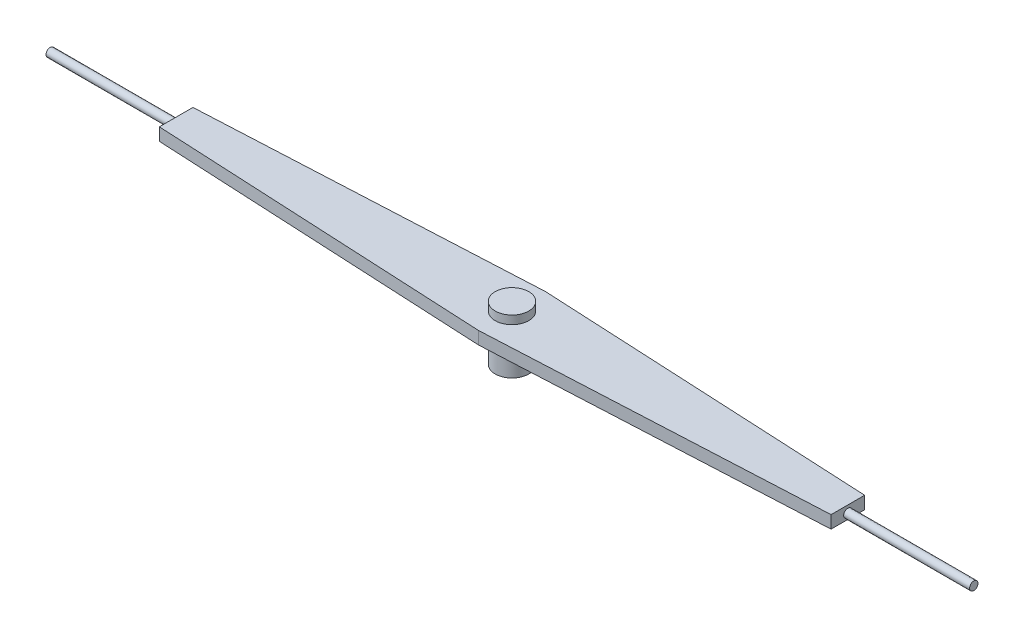
ISO-10303-21;
HEADER;
FILE_DESCRIPTION(('STEP AP214'),'2;1');
FILE_NAME('part.step','',(''),(''),'','','');
FILE_SCHEMA(('AUTOMOTIVE_DESIGN { 1 0 10303 214 1 1 1 1 }'));
ENDSEC;
DATA;
#1=APPLICATION_CONTEXT('core data for automotive mechanical design processes');
#2=APPLICATION_PROTOCOL_DEFINITION('international standard','automotive_design',2000,#1);
#3=PRODUCT_CONTEXT('',#1,'mechanical');
#4=PRODUCT('Part','Part','',(#3));
#5=PRODUCT_RELATED_PRODUCT_CATEGORY('part','',(#4));
#6=PRODUCT_DEFINITION_FORMATION('','',#4);
#7=PRODUCT_DEFINITION_CONTEXT('part definition',#1,'design');
#8=PRODUCT_DEFINITION('design','',#6,#7);
#9=PRODUCT_DEFINITION_SHAPE('','',#8);
#10=(LENGTH_UNIT() NAMED_UNIT(*) SI_UNIT(.MILLI.,.METRE.));
#11=(NAMED_UNIT(*) PLANE_ANGLE_UNIT() SI_UNIT($,.RADIAN.));
#12=(NAMED_UNIT(*) SI_UNIT($,.STERADIAN.) SOLID_ANGLE_UNIT());
#13=UNCERTAINTY_MEASURE_WITH_UNIT(LENGTH_MEASURE(1.E-05),#10,'distance_accuracy_value','');
#14=(GEOMETRIC_REPRESENTATION_CONTEXT(3) GLOBAL_UNCERTAINTY_ASSIGNED_CONTEXT((#13)) GLOBAL_UNIT_ASSIGNED_CONTEXT((#10,
#11,#12)) REPRESENTATION_CONTEXT('',''));
#15=CARTESIAN_POINT('',(0.,0.,0.));
#16=DIRECTION('',(0.,0.,1.));
#17=DIRECTION('',(1.,0.,0.));
#18=AXIS2_PLACEMENT_3D('',#15,#16,#17);
#19=CARTESIAN_POINT('',(-200.,7.5,0.));
#20=DIRECTION('',(-1.,0.,0.));
#21=DIRECTION('',(0.,0.,1.));
#22=AXIS2_PLACEMENT_3D('',#19,#20,#21);
#23=PLANE('',#22);
#24=CARTESIAN_POINT('',(-200.,3.46911629665806,0.));
#25=DIRECTION('',(-1.,0.,0.));
#26=DIRECTION('',(0.,0.,1.));
#27=AXIS2_PLACEMENT_3D('',#24,#25,#26);
#28=CIRCLE('',#27,2.5);
#29=CARTESIAN_POINT('',(-200.,3.46911629665806,2.5));
#30=VERTEX_POINT('',#29);
#31=EDGE_CURVE('E44',#30,#30,#28,.T.);
#32=ORIENTED_EDGE('',*,*,#31,.F.);
#33=EDGE_LOOP('',(#32));
#34=FACE_BOUND('',#33,.T.);
#35=DIRECTION('',(0.,0.,-1.));
#36=VECTOR('',#35,1.);
#37=CARTESIAN_POINT('',(-200.,0.,0.));
#38=LINE('',#37,#36);
#39=CARTESIAN_POINT('',(-200.,0.,10.));
#40=VERTEX_POINT('',#39);
#41=CARTESIAN_POINT('',(-200.,0.,-10.));
#42=VERTEX_POINT('',#41);
#43=EDGE_CURVE('E118',#40,#42,#38,.T.);
#44=ORIENTED_EDGE('',*,*,#43,.F.);
#45=DIRECTION('',(0.,-1.,0.));
#46=VECTOR('',#45,1.);
#47=CARTESIAN_POINT('',(-200.,7.5,10.));
#48=LINE('',#47,#46);
#49=CARTESIAN_POINT('',(-200.,7.5,10.));
#50=VERTEX_POINT('',#49);
#51=EDGE_CURVE('E87',#50,#40,#48,.T.);
#52=ORIENTED_EDGE('',*,*,#51,.F.);
#53=DIRECTION('',(0.,0.,-1.));
#54=VECTOR('',#53,1.);
#55=CARTESIAN_POINT('',(-200.,7.5,0.));
#56=LINE('',#55,#54);
#57=CARTESIAN_POINT('',(-200.,7.5,-10.));
#58=VERTEX_POINT('',#57);
#59=EDGE_CURVE('E132',#50,#58,#56,.T.);
#60=ORIENTED_EDGE('',*,*,#59,.T.);
#61=DIRECTION('',(0.,-1.,0.));
#62=VECTOR('',#61,1.);
#63=CARTESIAN_POINT('',(-200.,7.5,-10.));
#64=LINE('',#63,#62);
#65=EDGE_CURVE('E82',#58,#42,#64,.T.);
#66=ORIENTED_EDGE('',*,*,#65,.T.);
#67=EDGE_LOOP('',(#44,#52,#60,#66));
#68=FACE_BOUND('',#67,.T.);
#69=ADVANCED_FACE('F36',(#34,#68),#23,.T.);
#70=CARTESIAN_POINT('',(-0.997506234413966,7.5,19.9501246882793));
#71=DIRECTION('',(-0.0499376169438923,0.,0.998752338877845));
#72=DIRECTION('',(0.998752338877845,0.,0.0499376169438923));
#73=AXIS2_PLACEMENT_3D('',#70,#71,#72);
#74=PLANE('',#73);
#75=DIRECTION('',(-0.998752338877845,0.,-0.0499376169438923));
#76=VECTOR('',#75,1.);
#77=CARTESIAN_POINT('',(-0.997506234413966,0.,19.9501246882793));
#78=LINE('',#77,#76);
#79=CARTESIAN_POINT('',(0.,0.,20.));
#80=VERTEX_POINT('',#79);
#81=EDGE_CURVE('E121',#80,#40,#78,.T.);
#82=ORIENTED_EDGE('',*,*,#81,.F.);
#83=DIRECTION('',(0.,-1.,0.));
#84=VECTOR('',#83,1.);
#85=CARTESIAN_POINT('',(0.,7.5,20.));
#86=LINE('',#85,#84);
#87=CARTESIAN_POINT('',(0.,7.5,20.));
#88=VERTEX_POINT('',#87);
#89=EDGE_CURVE('E136',#88,#80,#86,.T.);
#90=ORIENTED_EDGE('',*,*,#89,.F.);
#91=DIRECTION('',(-0.998752338877845,0.,-0.0499376169438923));
#92=VECTOR('',#91,1.);
#93=CARTESIAN_POINT('',(-0.997506234413966,7.5,19.9501246882793));
#94=LINE('',#93,#92);
#95=EDGE_CURVE('E150',#88,#50,#94,.T.);
#96=ORIENTED_EDGE('',*,*,#95,.T.);
#97=ORIENTED_EDGE('',*,*,#51,.T.);
#98=EDGE_LOOP('',(#82,#90,#96,#97));
#99=FACE_BOUND('',#98,.T.);
#100=ADVANCED_FACE('F159',(#99),#74,.T.);
#101=CARTESIAN_POINT('',(0.997506234413966,7.5,19.9501246882793));
#102=DIRECTION('',(0.0499376169438923,0.,0.998752338877845));
#103=DIRECTION('',(0.998752338877845,0.,-0.0499376169438923));
#104=AXIS2_PLACEMENT_3D('',#101,#102,#103);
#105=PLANE('',#104);
#106=DIRECTION('',(-0.998752338877845,0.,0.0499376169438923));
#107=VECTOR('',#106,1.);
#108=CARTESIAN_POINT('',(0.997506234413966,0.,19.9501246882793));
#109=LINE('',#108,#107);
#110=CARTESIAN_POINT('',(200.,0.,10.));
#111=VERTEX_POINT('',#110);
#112=EDGE_CURVE('E125',#111,#80,#109,.T.);
#113=ORIENTED_EDGE('',*,*,#112,.F.);
#114=DIRECTION('',(0.,-1.,0.));
#115=VECTOR('',#114,1.);
#116=CARTESIAN_POINT('',(200.,7.5,10.));
#117=LINE('',#116,#115);
#118=CARTESIAN_POINT('',(200.,7.5,10.));
#119=VERTEX_POINT('',#118);
#120=EDGE_CURVE('E110',#119,#111,#117,.T.);
#121=ORIENTED_EDGE('',*,*,#120,.F.);
#122=DIRECTION('',(-0.998752338877845,0.,0.0499376169438923));
#123=VECTOR('',#122,1.);
#124=CARTESIAN_POINT('',(0.997506234413966,7.5,19.9501246882793));
#125=LINE('',#124,#123);
#126=EDGE_CURVE('E103',#119,#88,#125,.T.);
#127=ORIENTED_EDGE('',*,*,#126,.T.);
#128=ORIENTED_EDGE('',*,*,#89,.T.);
#129=EDGE_LOOP('',(#113,#121,#127,#128));
#130=FACE_BOUND('',#129,.T.);
#131=ADVANCED_FACE('F153',(#130),#105,.T.);
#132=CARTESIAN_POINT('',(200.,7.5,0.));
#133=DIRECTION('',(-1.,0.,0.));
#134=DIRECTION('',(0.,0.,1.));
#135=AXIS2_PLACEMENT_3D('',#132,#133,#134);
#136=PLANE('',#135);
#137=CARTESIAN_POINT('',(200.,3.29626478690789,0.));
#138=DIRECTION('',(1.,0.,0.));
#139=DIRECTION('',(0.,0.,-1.));
#140=AXIS2_PLACEMENT_3D('',#137,#138,#139);
#141=CIRCLE('',#140,2.5);
#142=CARTESIAN_POINT('',(200.,3.29626478690789,-2.5));
#143=VERTEX_POINT('',#142);
#144=EDGE_CURVE('E137',#143,#143,#141,.T.);
#145=ORIENTED_EDGE('',*,*,#144,.F.);
#146=EDGE_LOOP('',(#145));
#147=FACE_BOUND('',#146,.T.);
#148=DIRECTION('',(0.,0.,-1.));
#149=VECTOR('',#148,1.);
#150=CARTESIAN_POINT('',(200.,0.,0.));
#151=LINE('',#150,#149);
#152=CARTESIAN_POINT('',(200.,0.,-10.));
#153=VERTEX_POINT('',#152);
#154=EDGE_CURVE('E109',#111,#153,#151,.T.);
#155=ORIENTED_EDGE('',*,*,#154,.T.);
#156=DIRECTION('',(0.,-1.,0.));
#157=VECTOR('',#156,1.);
#158=CARTESIAN_POINT('',(200.,7.5,-10.));
#159=LINE('',#158,#157);
#160=CARTESIAN_POINT('',(200.,7.5,-10.));
#161=VERTEX_POINT('',#160);
#162=EDGE_CURVE('E106',#161,#153,#159,.T.);
#163=ORIENTED_EDGE('',*,*,#162,.F.);
#164=DIRECTION('',(0.,0.,-1.));
#165=VECTOR('',#164,1.);
#166=CARTESIAN_POINT('',(200.,7.5,0.));
#167=LINE('',#166,#165);
#168=EDGE_CURVE('E96',#119,#161,#167,.T.);
#169=ORIENTED_EDGE('',*,*,#168,.F.);
#170=ORIENTED_EDGE('',*,*,#120,.T.);
#171=EDGE_LOOP('',(#155,#163,#169,#170));
#172=FACE_BOUND('',#171,.T.);
#173=ADVANCED_FACE('F107',(#147,#172),#136,.F.);
#174=CARTESIAN_POINT('',(0.997506234413965,7.5,-19.9501246882793));
#175=DIRECTION('',(-0.0499376169438922,0.,0.998752338877845));
#176=DIRECTION('',(0.998752338877845,0.,0.0499376169438922));
#177=AXIS2_PLACEMENT_3D('',#174,#175,#176);
#178=PLANE('',#177);
#179=DIRECTION('',(-0.998752338877845,0.,-0.0499376169438922));
#180=VECTOR('',#179,1.);
#181=CARTESIAN_POINT('',(0.997506234413965,0.,-19.9501246882793));
#182=LINE('',#181,#180);
#183=CARTESIAN_POINT('',(0.,0.,-20.));
#184=VERTEX_POINT('',#183);
#185=EDGE_CURVE('E75',#153,#184,#182,.T.);
#186=ORIENTED_EDGE('',*,*,#185,.T.);
#187=DIRECTION('',(0.,-1.,0.));
#188=VECTOR('',#187,1.);
#189=CARTESIAN_POINT('',(0.,7.5,-20.));
#190=LINE('',#189,#188);
#191=CARTESIAN_POINT('',(0.,7.5,-20.));
#192=VERTEX_POINT('',#191);
#193=EDGE_CURVE('E111',#192,#184,#190,.T.);
#194=ORIENTED_EDGE('',*,*,#193,.F.);
#195=DIRECTION('',(-0.998752338877845,0.,-0.0499376169438922));
#196=VECTOR('',#195,1.);
#197=CARTESIAN_POINT('',(0.997506234413965,7.5,-19.9501246882793));
#198=LINE('',#197,#196);
#199=EDGE_CURVE('E100',#161,#192,#198,.T.);
#200=ORIENTED_EDGE('',*,*,#199,.F.);
#201=ORIENTED_EDGE('',*,*,#162,.T.);
#202=EDGE_LOOP('',(#186,#194,#200,#201));
#203=FACE_BOUND('',#202,.T.);
#204=ADVANCED_FACE('F113',(#203),#178,.F.);
#205=CARTESIAN_POINT('',(-0.997506234413965,7.5,-19.9501246882793));
#206=DIRECTION('',(0.0499376169438922,0.,0.998752338877845));
#207=DIRECTION('',(0.998752338877845,0.,-0.0499376169438922));
#208=AXIS2_PLACEMENT_3D('',#205,#206,#207);
#209=PLANE('',#208);
#210=DIRECTION('',(-0.998752338877845,0.,0.0499376169438922));
#211=VECTOR('',#210,1.);
#212=CARTESIAN_POINT('',(-0.997506234413965,0.,-19.9501246882793));
#213=LINE('',#212,#211);
#214=EDGE_CURVE('E130',#184,#42,#213,.T.);
#215=ORIENTED_EDGE('',*,*,#214,.T.);
#216=ORIENTED_EDGE('',*,*,#65,.F.);
#217=DIRECTION('',(-0.998752338877845,0.,0.0499376169438922));
#218=VECTOR('',#217,1.);
#219=CARTESIAN_POINT('',(-0.997506234413965,7.5,-19.9501246882793));
#220=LINE('',#219,#218);
#221=EDGE_CURVE('E52',#192,#58,#220,.T.);
#222=ORIENTED_EDGE('',*,*,#221,.F.);
#223=ORIENTED_EDGE('',*,*,#193,.T.);
#224=EDGE_LOOP('',(#215,#216,#222,#223));
#225=FACE_BOUND('',#224,.T.);
#226=ADVANCED_FACE('F158',(#225),#209,.F.);
#227=CARTESIAN_POINT('',(0.,7.5,0.));
#228=DIRECTION('',(0.,1.,0.));
#229=DIRECTION('',(0.,0.,1.));
#230=AXIS2_PLACEMENT_3D('',#227,#228,#229);
#231=PLANE('',#230);
#232=CARTESIAN_POINT('',(0.,7.5,0.));
#233=DIRECTION('',(0.,1.,0.));
#234=DIRECTION('',(0.,0.,1.));
#235=AXIS2_PLACEMENT_3D('',#232,#233,#234);
#236=CIRCLE('',#235,10.);
#237=CARTESIAN_POINT('',(0.,7.5,10.));
#238=VERTEX_POINT('',#237);
#239=EDGE_CURVE('E229',#238,#238,#236,.T.);
#240=ORIENTED_EDGE('',*,*,#239,.F.);
#241=EDGE_LOOP('',(#240));
#242=FACE_BOUND('',#241,.T.);
#243=ORIENTED_EDGE('',*,*,#59,.F.);
#244=ORIENTED_EDGE('',*,*,#95,.F.);
#245=ORIENTED_EDGE('',*,*,#126,.F.);
#246=ORIENTED_EDGE('',*,*,#168,.T.);
#247=ORIENTED_EDGE('',*,*,#199,.T.);
#248=ORIENTED_EDGE('',*,*,#221,.T.);
#249=EDGE_LOOP('',(#243,#244,#245,#246,#247,#248));
#250=FACE_BOUND('',#249,.T.);
#251=ADVANCED_FACE('F98',(#242,#250),#231,.T.);
#252=CARTESIAN_POINT('',(0.,0.,0.));
#253=DIRECTION('',(0.,1.,0.));
#254=DIRECTION('',(0.,0.,1.));
#255=AXIS2_PLACEMENT_3D('',#252,#253,#254);
#256=PLANE('',#255);
#257=CARTESIAN_POINT('',(0.,0.,0.));
#258=DIRECTION('',(0.,1.,0.));
#259=DIRECTION('',(0.,0.,1.));
#260=AXIS2_PLACEMENT_3D('',#257,#258,#259);
#261=CIRCLE('',#260,10.);
#262=CARTESIAN_POINT('',(0.,0.,10.));
#263=VERTEX_POINT('',#262);
#264=EDGE_CURVE('E11',#263,#263,#261,.F.);
#265=ORIENTED_EDGE('',*,*,#264,.F.);
#266=EDGE_LOOP('',(#265));
#267=FACE_BOUND('',#266,.T.);
#268=ORIENTED_EDGE('',*,*,#43,.T.);
#269=ORIENTED_EDGE('',*,*,#214,.F.);
#270=ORIENTED_EDGE('',*,*,#185,.F.);
#271=ORIENTED_EDGE('',*,*,#154,.F.);
#272=ORIENTED_EDGE('',*,*,#112,.T.);
#273=ORIENTED_EDGE('',*,*,#81,.T.);
#274=EDGE_LOOP('',(#268,#269,#270,#271,#272,#273));
#275=FACE_BOUND('',#274,.T.);
#276=ADVANCED_FACE('F155',(#267,#275),#256,.F.);
#277=CARTESIAN_POINT('',(275.,3.29626478690789,0.));
#278=DIRECTION('',(-1.,0.,0.));
#279=DIRECTION('',(0.,0.,1.));
#280=AXIS2_PLACEMENT_3D('',#277,#278,#279);
#281=CYLINDRICAL_SURFACE('',#280,2.5);
#282=CARTESIAN_POINT('',(275.,3.29626478690789,0.));
#283=DIRECTION('',(1.,0.,0.));
#284=DIRECTION('',(0.,0.,-1.));
#285=AXIS2_PLACEMENT_3D('',#282,#283,#284);
#286=CIRCLE('',#285,2.5);
#287=CARTESIAN_POINT('',(275.,3.29626478690789,-2.5));
#288=VERTEX_POINT('',#287);
#289=EDGE_CURVE('E122',#288,#288,#286,.T.);
#290=ORIENTED_EDGE('',*,*,#289,.F.);
#291=EDGE_LOOP('',(#290));
#292=FACE_BOUND('',#291,.T.);
#293=ORIENTED_EDGE('',*,*,#144,.T.);
#294=EDGE_LOOP('',(#293));
#295=FACE_BOUND('',#294,.T.);
#296=ADVANCED_FACE('F177',(#292,#295),#281,.T.);
#297=CARTESIAN_POINT('',(275.,3.29626478690789,0.));
#298=DIRECTION('',(1.,0.,0.));
#299=DIRECTION('',(0.,0.,-1.));
#300=AXIS2_PLACEMENT_3D('',#297,#298,#299);
#301=PLANE('',#300);
#302=ORIENTED_EDGE('',*,*,#289,.T.);
#303=EDGE_LOOP('',(#302));
#304=FACE_BOUND('',#303,.T.);
#305=ADVANCED_FACE('F184',(#304),#301,.T.);
#306=CARTESIAN_POINT('',(-275.,3.46911629665806,0.));
#307=DIRECTION('',(1.,0.,0.));
#308=DIRECTION('',(0.,0.,-1.));
#309=AXIS2_PLACEMENT_3D('',#306,#307,#308);
#310=CYLINDRICAL_SURFACE('',#309,2.5);
#311=CARTESIAN_POINT('',(-275.,3.46911629665806,0.));
#312=DIRECTION('',(-1.,0.,0.));
#313=DIRECTION('',(0.,0.,1.));
#314=AXIS2_PLACEMENT_3D('',#311,#312,#313);
#315=CIRCLE('',#314,2.5);
#316=CARTESIAN_POINT('',(-275.,3.46911629665806,2.5));
#317=VERTEX_POINT('',#316);
#318=EDGE_CURVE('E237',#317,#317,#315,.T.);
#319=ORIENTED_EDGE('',*,*,#318,.F.);
#320=EDGE_LOOP('',(#319));
#321=FACE_BOUND('',#320,.T.);
#322=ORIENTED_EDGE('',*,*,#31,.T.);
#323=EDGE_LOOP('',(#322));
#324=FACE_BOUND('',#323,.T.);
#325=ADVANCED_FACE('F188',(#321,#324),#310,.T.);
#326=CARTESIAN_POINT('',(-275.,3.46911629665806,0.));
#327=DIRECTION('',(-1.,0.,0.));
#328=DIRECTION('',(0.,0.,1.));
#329=AXIS2_PLACEMENT_3D('',#326,#327,#328);
#330=PLANE('',#329);
#331=ORIENTED_EDGE('',*,*,#318,.T.);
#332=EDGE_LOOP('',(#331));
#333=FACE_BOUND('',#332,.T.);
#334=ADVANCED_FACE('F192',(#333),#330,.T.);
#335=CARTESIAN_POINT('',(0.,12.5,0.));
#336=DIRECTION('',(0.,-1.,0.));
#337=DIRECTION('',(0.,0.,-1.));
#338=AXIS2_PLACEMENT_3D('',#335,#336,#337);
#339=CYLINDRICAL_SURFACE('',#338,10.);
#340=CARTESIAN_POINT('',(0.,12.5,0.));
#341=DIRECTION('',(0.,1.,0.));
#342=DIRECTION('',(0.,0.,1.));
#343=AXIS2_PLACEMENT_3D('',#340,#341,#342);
#344=CIRCLE('',#343,10.);
#345=CARTESIAN_POINT('',(0.,12.5,10.));
#346=VERTEX_POINT('',#345);
#347=EDGE_CURVE('E234',#346,#346,#344,.T.);
#348=ORIENTED_EDGE('',*,*,#347,.F.);
#349=EDGE_LOOP('',(#348));
#350=FACE_BOUND('',#349,.T.);
#351=ORIENTED_EDGE('',*,*,#239,.T.);
#352=EDGE_LOOP('',(#351));
#353=FACE_BOUND('',#352,.T.);
#354=ADVANCED_FACE('F196',(#350,#353),#339,.T.);
#355=CARTESIAN_POINT('',(0.,12.5,0.));
#356=DIRECTION('',(0.,1.,0.));
#357=DIRECTION('',(0.,0.,1.));
#358=AXIS2_PLACEMENT_3D('',#355,#356,#357);
#359=PLANE('',#358);
#360=ORIENTED_EDGE('',*,*,#347,.T.);
#361=EDGE_LOOP('',(#360));
#362=FACE_BOUND('',#361,.T.);
#363=ADVANCED_FACE('F200',(#362),#359,.T.);
#364=CARTESIAN_POINT('',(0.,-20.,0.));
#365=DIRECTION('',(0.,1.,0.));
#366=DIRECTION('',(0.,0.,1.));
#367=AXIS2_PLACEMENT_3D('',#364,#365,#366);
#368=CYLINDRICAL_SURFACE('',#367,10.);
#369=CARTESIAN_POINT('',(0.,-20.,0.));
#370=DIRECTION('',(0.,-1.,0.));
#371=DIRECTION('',(0.,0.,-1.));
#372=AXIS2_PLACEMENT_3D('',#369,#370,#371);
#373=CIRCLE('',#372,10.);
#374=CARTESIAN_POINT('',(0.,-20.,-10.));
#375=VERTEX_POINT('',#374);
#376=EDGE_CURVE('E225',#375,#375,#373,.T.);
#377=ORIENTED_EDGE('',*,*,#376,.F.);
#378=EDGE_LOOP('',(#377));
#379=FACE_BOUND('',#378,.T.);
#380=ORIENTED_EDGE('',*,*,#264,.T.);
#381=EDGE_LOOP('',(#380));
#382=FACE_BOUND('',#381,.T.);
#383=ADVANCED_FACE('F204',(#379,#382),#368,.T.);
#384=CARTESIAN_POINT('',(0.,-20.,0.));
#385=DIRECTION('',(0.,-1.,0.));
#386=DIRECTION('',(0.,0.,-1.));
#387=AXIS2_PLACEMENT_3D('',#384,#385,#386);
#388=PLANE('',#387);
#389=CARTESIAN_POINT('',(0.,-20.,0.));
#390=DIRECTION('',(0.,-1.,0.));
#391=DIRECTION('',(0.,0.,-1.));
#392=AXIS2_PLACEMENT_3D('',#389,#390,#391);
#393=CIRCLE('',#392,8.);
#394=CARTESIAN_POINT('',(0.,-20.,-8.));
#395=VERTEX_POINT('',#394);
#396=EDGE_CURVE('E226',#395,#395,#393,.T.);
#397=ORIENTED_EDGE('',*,*,#396,.F.);
#398=EDGE_LOOP('',(#397));
#399=FACE_BOUND('',#398,.T.);
#400=ORIENTED_EDGE('',*,*,#376,.T.);
#401=EDGE_LOOP('',(#400));
#402=FACE_BOUND('',#401,.T.);
#403=ADVANCED_FACE('F208',(#399,#402),#388,.T.);
#404=CARTESIAN_POINT('',(0.,-5.,0.));
#405=DIRECTION('',(0.,-1.,0.));
#406=DIRECTION('',(0.,0.,-1.));
#407=AXIS2_PLACEMENT_3D('',#404,#405,#406);
#408=CYLINDRICAL_SURFACE('',#407,8.);
#409=CARTESIAN_POINT('',(0.,-5.,0.));
#410=DIRECTION('',(0.,-1.,0.));
#411=DIRECTION('',(0.,0.,-1.));
#412=AXIS2_PLACEMENT_3D('',#409,#410,#411);
#413=CIRCLE('',#412,8.);
#414=CARTESIAN_POINT('',(0.,-5.,-8.));
#415=VERTEX_POINT('',#414);
#416=EDGE_CURVE('E224',#415,#415,#413,.T.);
#417=ORIENTED_EDGE('',*,*,#416,.F.);
#418=EDGE_LOOP('',(#417));
#419=FACE_BOUND('',#418,.T.);
#420=ORIENTED_EDGE('',*,*,#396,.T.);
#421=EDGE_LOOP('',(#420));
#422=FACE_BOUND('',#421,.T.);
#423=ADVANCED_FACE('F212',(#419,#422),#408,.F.);
#424=CARTESIAN_POINT('',(0.,-5.,0.));
#425=DIRECTION('',(0.,-1.,0.));
#426=DIRECTION('',(0.,0.,-1.));
#427=AXIS2_PLACEMENT_3D('',#424,#425,#426);
#428=PLANE('',#427);
#429=ORIENTED_EDGE('',*,*,#416,.T.);
#430=EDGE_LOOP('',(#429));
#431=FACE_BOUND('',#430,.T.);
#432=ADVANCED_FACE('F216',(#431),#428,.T.);
#433=CLOSED_SHELL('',(#69,#100,#131,#173,#204,#226,#251,#276,#296,#305,#325,#334,#354,#363,#383,
#403,#423,#432));
#434=MANIFOLD_SOLID_BREP('B2',#433);
#435=ADVANCED_BREP_SHAPE_REPRESENTATION('',(#18,#434),#14);
#436=SHAPE_DEFINITION_REPRESENTATION(#9,#435);
ENDSEC;
END-ISO-10303-21;
